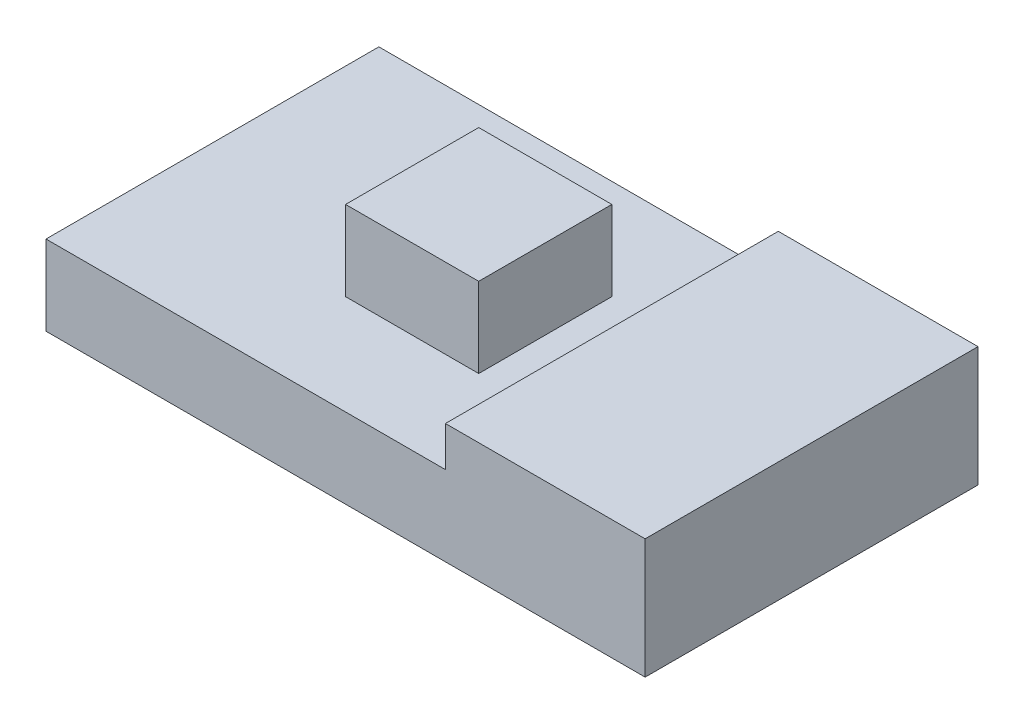
ISO-10303-21;
HEADER;
FILE_DESCRIPTION(('STEP AP214'),'2;1');
FILE_NAME('part.step','',(''),(''),'','','');
FILE_SCHEMA(('AUTOMOTIVE_DESIGN { 1 0 10303 214 1 1 1 1 }'));
ENDSEC;
DATA;
#1=APPLICATION_CONTEXT('core data for automotive mechanical design processes');
#2=APPLICATION_PROTOCOL_DEFINITION('international standard','automotive_design',2000,#1);
#3=PRODUCT_CONTEXT('',#1,'mechanical');
#4=PRODUCT('Part','Part','',(#3));
#5=PRODUCT_RELATED_PRODUCT_CATEGORY('part','',(#4));
#6=PRODUCT_DEFINITION_FORMATION('','',#4);
#7=PRODUCT_DEFINITION_CONTEXT('part definition',#1,'design');
#8=PRODUCT_DEFINITION('design','',#6,#7);
#9=PRODUCT_DEFINITION_SHAPE('','',#8);
#10=(LENGTH_UNIT() NAMED_UNIT(*) SI_UNIT(.MILLI.,.METRE.));
#11=(NAMED_UNIT(*) PLANE_ANGLE_UNIT() SI_UNIT($,.RADIAN.));
#12=(NAMED_UNIT(*) SI_UNIT($,.STERADIAN.) SOLID_ANGLE_UNIT());
#13=UNCERTAINTY_MEASURE_WITH_UNIT(LENGTH_MEASURE(1.E-05),#10,'distance_accuracy_value','');
#14=(GEOMETRIC_REPRESENTATION_CONTEXT(3) GLOBAL_UNCERTAINTY_ASSIGNED_CONTEXT((#13)) GLOBAL_UNIT_ASSIGNED_CONTEXT((#10,
#11,#12)) REPRESENTATION_CONTEXT('',''));
#15=CARTESIAN_POINT('',(0.,0.,0.));
#16=DIRECTION('',(0.,0.,1.));
#17=DIRECTION('',(1.,0.,0.));
#18=AXIS2_PLACEMENT_3D('',#15,#16,#17);
#19=CARTESIAN_POINT('',(-15.9090909090909,6.,-12.5));
#20=DIRECTION('',(1.,0.,0.));
#21=DIRECTION('',(0.,0.,-1.));
#22=AXIS2_PLACEMENT_3D('',#19,#20,#21);
#23=PLANE('',#22);
#24=DIRECTION('',(0.,0.,-1.));
#25=VECTOR('',#24,1.);
#26=CARTESIAN_POINT('',(-15.9090909090909,6.,12.5));
#27=LINE('',#26,#25);
#28=CARTESIAN_POINT('',(-15.9090909090909,6.,5.));
#29=VERTEX_POINT('',#28);
#30=CARTESIAN_POINT('',(-15.9090909090909,6.,-5.));
#31=VERTEX_POINT('',#30);
#32=EDGE_CURVE('E11',#29,#31,#27,.T.);
#33=ORIENTED_EDGE('',*,*,#32,.F.);
#34=DIRECTION('',(0.,-1.,0.));
#35=VECTOR('',#34,1.);
#36=CARTESIAN_POINT('',(-15.9090909090909,12.,5.));
#37=LINE('',#36,#35);
#38=CARTESIAN_POINT('',(-15.9090909090909,12.,5.));
#39=VERTEX_POINT('',#38);
#40=EDGE_CURVE('E186',#39,#29,#37,.T.);
#41=ORIENTED_EDGE('',*,*,#40,.F.);
#42=DIRECTION('',(0.,0.,1.));
#43=VECTOR('',#42,1.);
#44=CARTESIAN_POINT('',(-15.9090909090909,12.,-5.));
#45=LINE('',#44,#43);
#46=CARTESIAN_POINT('',(-15.9090909090909,12.,-5.));
#47=VERTEX_POINT('',#46);
#48=EDGE_CURVE('E155',#47,#39,#45,.T.);
#49=ORIENTED_EDGE('',*,*,#48,.F.);
#50=DIRECTION('',(0.,-1.,0.));
#51=VECTOR('',#50,1.);
#52=CARTESIAN_POINT('',(-15.9090909090909,12.,-5.));
#53=LINE('',#52,#51);
#54=EDGE_CURVE('E169',#47,#31,#53,.T.);
#55=ORIENTED_EDGE('',*,*,#54,.T.);
#56=EDGE_LOOP('',(#33,#41,#49,#55));
#57=FACE_BOUND('',#56,.T.);
#58=ADVANCED_FACE('F41',(#57),#23,.F.);
#59=CARTESIAN_POINT('',(0.,6.,0.));
#60=DIRECTION('',(0.,1.,0.));
#61=DIRECTION('',(0.,0.,1.));
#62=AXIS2_PLACEMENT_3D('',#59,#60,#61);
#63=PLANE('',#62);
#64=DIRECTION('',(0.,0.,-1.));
#65=VECTOR('',#64,1.);
#66=CARTESIAN_POINT('',(-30.9090909090909,6.,12.5));
#67=LINE('',#66,#65);
#68=CARTESIAN_POINT('',(-30.9090909090909,6.,12.5));
#69=VERTEX_POINT('',#68);
#70=CARTESIAN_POINT('',(-30.9090909090909,6.,-12.5));
#71=VERTEX_POINT('',#70);
#72=EDGE_CURVE('E123',#69,#71,#67,.T.);
#73=ORIENTED_EDGE('',*,*,#72,.F.);
#74=DIRECTION('',(1.,0.,0.));
#75=VECTOR('',#74,1.);
#76=CARTESIAN_POINT('',(-15.9090909090909,6.,12.5));
#77=LINE('',#76,#75);
#78=CARTESIAN_POINT('',(-0.909090909090918,6.,12.5));
#79=VERTEX_POINT('',#78);
#80=EDGE_CURVE('E129',#69,#79,#77,.T.);
#81=ORIENTED_EDGE('',*,*,#80,.T.);
#82=DIRECTION('',(0.,0.,1.));
#83=VECTOR('',#82,1.);
#84=CARTESIAN_POINT('',(-0.909090909090922,6.,-12.5));
#85=LINE('',#84,#83);
#86=CARTESIAN_POINT('',(-0.90909090909092,6.,-12.5));
#87=VERTEX_POINT('',#86);
#88=EDGE_CURVE('E65',#87,#79,#85,.T.);
#89=ORIENTED_EDGE('',*,*,#88,.F.);
#90=DIRECTION('',(-1.,0.,0.));
#91=VECTOR('',#90,1.);
#92=CARTESIAN_POINT('',(-15.9090909090909,6.,-12.5));
#93=LINE('',#92,#91);
#94=EDGE_CURVE('E118',#87,#71,#93,.T.);
#95=ORIENTED_EDGE('',*,*,#94,.T.);
#96=EDGE_LOOP('',(#73,#81,#89,#95));
#97=FACE_BOUND('',#96,.T.);
#98=DIRECTION('',(0.,0.,-1.));
#99=VECTOR('',#98,1.);
#100=CARTESIAN_POINT('',(-5.90909090909092,6.,-5.));
#101=LINE('',#100,#99);
#102=CARTESIAN_POINT('',(-5.90909090909092,6.,5.));
#103=VERTEX_POINT('',#102);
#104=CARTESIAN_POINT('',(-5.90909090909092,6.,-5.));
#105=VERTEX_POINT('',#104);
#106=EDGE_CURVE('E172',#103,#105,#101,.T.);
#107=ORIENTED_EDGE('',*,*,#106,.F.);
#108=DIRECTION('',(1.,0.,0.));
#109=VECTOR('',#108,1.);
#110=CARTESIAN_POINT('',(-15.9090909090909,6.,5.));
#111=LINE('',#110,#109);
#112=EDGE_CURVE('E153',#29,#103,#111,.T.);
#113=ORIENTED_EDGE('',*,*,#112,.F.);
#114=ORIENTED_EDGE('',*,*,#32,.T.);
#115=DIRECTION('',(-1.,0.,0.));
#116=VECTOR('',#115,1.);
#117=CARTESIAN_POINT('',(-15.9090909090909,6.,-5.));
#118=LINE('',#117,#116);
#119=EDGE_CURVE('E160',#105,#31,#118,.T.);
#120=ORIENTED_EDGE('',*,*,#119,.F.);
#121=EDGE_LOOP('',(#107,#113,#114,#120));
#122=FACE_BOUND('',#121,.T.);
#123=ADVANCED_FACE('F120',(#97,#122),#63,.T.);
#124=CARTESIAN_POINT('',(-15.9090909090909,6.,12.5));
#125=DIRECTION('',(0.,0.,-1.));
#126=DIRECTION('',(-1.,0.,0.));
#127=AXIS2_PLACEMENT_3D('',#124,#125,#126);
#128=PLANE('',#127);
#129=DIRECTION('',(1.,0.,0.));
#130=VECTOR('',#129,1.);
#131=CARTESIAN_POINT('',(-15.9090909090909,0.,12.5));
#132=LINE('',#131,#130);
#133=CARTESIAN_POINT('',(-30.9090909090909,0.,12.5));
#134=VERTEX_POINT('',#133);
#135=CARTESIAN_POINT('',(14.0909090909091,0.,12.5));
#136=VERTEX_POINT('',#135);
#137=EDGE_CURVE('E214',#134,#136,#132,.T.);
#138=ORIENTED_EDGE('',*,*,#137,.T.);
#139=DIRECTION('',(0.,-1.,0.));
#140=VECTOR('',#139,1.);
#141=CARTESIAN_POINT('',(14.0909090909091,6.,12.5));
#142=LINE('',#141,#140);
#143=CARTESIAN_POINT('',(14.0909090909091,9.,12.5));
#144=VERTEX_POINT('',#143);
#145=EDGE_CURVE('E44',#144,#136,#142,.T.);
#146=ORIENTED_EDGE('',*,*,#145,.F.);
#147=DIRECTION('',(1.,0.,0.));
#148=VECTOR('',#147,1.);
#149=CARTESIAN_POINT('',(-0.909090909090918,9.,12.5));
#150=LINE('',#149,#148);
#151=CARTESIAN_POINT('',(-0.909090909090918,9.,12.5));
#152=VERTEX_POINT('',#151);
#153=EDGE_CURVE('E197',#152,#144,#150,.T.);
#154=ORIENTED_EDGE('',*,*,#153,.F.);
#155=DIRECTION('',(0.,-1.,0.));
#156=VECTOR('',#155,1.);
#157=CARTESIAN_POINT('',(-0.909090909090918,9.,12.5));
#158=LINE('',#157,#156);
#159=EDGE_CURVE('E205',#152,#79,#158,.T.);
#160=ORIENTED_EDGE('',*,*,#159,.T.);
#161=ORIENTED_EDGE('',*,*,#80,.F.);
#162=DIRECTION('',(0.,1.,0.));
#163=VECTOR('',#162,1.);
#164=CARTESIAN_POINT('',(-30.9090909090909,0.,12.5));
#165=LINE('',#164,#163);
#166=EDGE_CURVE('E146',#134,#69,#165,.T.);
#167=ORIENTED_EDGE('',*,*,#166,.F.);
#168=EDGE_LOOP('',(#138,#146,#154,#160,#161,#167));
#169=FACE_BOUND('',#168,.T.);
#170=ADVANCED_FACE('F235',(#169),#128,.F.);
#171=CARTESIAN_POINT('',(14.0909090909091,6.,-12.5));
#172=DIRECTION('',(-1.,0.,0.));
#173=DIRECTION('',(0.,0.,1.));
#174=AXIS2_PLACEMENT_3D('',#171,#172,#173);
#175=PLANE('',#174);
#176=DIRECTION('',(0.,0.,-1.));
#177=VECTOR('',#176,1.);
#178=CARTESIAN_POINT('',(14.0909090909091,0.,-12.5));
#179=LINE('',#178,#177);
#180=CARTESIAN_POINT('',(14.0909090909091,0.,-12.5));
#181=VERTEX_POINT('',#180);
#182=EDGE_CURVE('E219',#136,#181,#179,.T.);
#183=ORIENTED_EDGE('',*,*,#182,.T.);
#184=DIRECTION('',(0.,-1.,0.));
#185=VECTOR('',#184,1.);
#186=CARTESIAN_POINT('',(14.0909090909091,6.,-12.5));
#187=LINE('',#186,#185);
#188=CARTESIAN_POINT('',(14.0909090909091,9.,-12.5));
#189=VERTEX_POINT('',#188);
#190=EDGE_CURVE('E128',#189,#181,#187,.T.);
#191=ORIENTED_EDGE('',*,*,#190,.F.);
#192=DIRECTION('',(0.,0.,-1.));
#193=VECTOR('',#192,1.);
#194=CARTESIAN_POINT('',(14.0909090909091,9.,12.5));
#195=LINE('',#194,#193);
#196=EDGE_CURVE('E201',#144,#189,#195,.T.);
#197=ORIENTED_EDGE('',*,*,#196,.F.);
#198=ORIENTED_EDGE('',*,*,#145,.T.);
#199=EDGE_LOOP('',(#183,#191,#197,#198));
#200=FACE_BOUND('',#199,.T.);
#201=ADVANCED_FACE('F230',(#200),#175,.F.);
#202=CARTESIAN_POINT('',(-15.9090909090909,6.,-12.5));
#203=DIRECTION('',(0.,0.,1.));
#204=DIRECTION('',(1.,0.,0.));
#205=AXIS2_PLACEMENT_3D('',#202,#203,#204);
#206=PLANE('',#205);
#207=DIRECTION('',(-1.,0.,0.));
#208=VECTOR('',#207,1.);
#209=CARTESIAN_POINT('',(-15.9090909090909,0.,-12.5));
#210=LINE('',#209,#208);
#211=CARTESIAN_POINT('',(-30.9090909090909,0.,-12.5));
#212=VERTEX_POINT('',#211);
#213=EDGE_CURVE('E136',#181,#212,#210,.T.);
#214=ORIENTED_EDGE('',*,*,#213,.T.);
#215=DIRECTION('',(0.,-1.,0.));
#216=VECTOR('',#215,1.);
#217=CARTESIAN_POINT('',(-30.9090909090909,6.,-12.5));
#218=LINE('',#217,#216);
#219=EDGE_CURVE('E132',#71,#212,#218,.T.);
#220=ORIENTED_EDGE('',*,*,#219,.F.);
#221=ORIENTED_EDGE('',*,*,#94,.F.);
#222=DIRECTION('',(0.,-1.,0.));
#223=VECTOR('',#222,1.);
#224=CARTESIAN_POINT('',(-0.909090909090922,9.,-12.5));
#225=LINE('',#224,#223);
#226=CARTESIAN_POINT('',(-0.909090909090922,9.,-12.5));
#227=VERTEX_POINT('',#226);
#228=EDGE_CURVE('E211',#227,#87,#225,.T.);
#229=ORIENTED_EDGE('',*,*,#228,.F.);
#230=DIRECTION('',(-1.,0.,0.));
#231=VECTOR('',#230,1.);
#232=CARTESIAN_POINT('',(14.0909090909091,9.,-12.5));
#233=LINE('',#232,#231);
#234=EDGE_CURVE('E190',#189,#227,#233,.T.);
#235=ORIENTED_EDGE('',*,*,#234,.F.);
#236=ORIENTED_EDGE('',*,*,#190,.T.);
#237=EDGE_LOOP('',(#214,#220,#221,#229,#235,#236));
#238=FACE_BOUND('',#237,.T.);
#239=ADVANCED_FACE('F133',(#238),#206,.F.);
#240=CARTESIAN_POINT('',(0.,0.,0.));
#241=DIRECTION('',(0.,1.,0.));
#242=DIRECTION('',(0.,0.,1.));
#243=AXIS2_PLACEMENT_3D('',#240,#241,#242);
#244=PLANE('',#243);
#245=ORIENTED_EDGE('',*,*,#137,.F.);
#246=DIRECTION('',(0.,0.,1.));
#247=VECTOR('',#246,1.);
#248=CARTESIAN_POINT('',(-30.9090909090909,0.,-12.5));
#249=LINE('',#248,#247);
#250=EDGE_CURVE('E141',#212,#134,#249,.T.);
#251=ORIENTED_EDGE('',*,*,#250,.F.);
#252=ORIENTED_EDGE('',*,*,#213,.F.);
#253=ORIENTED_EDGE('',*,*,#182,.F.);
#254=EDGE_LOOP('',(#245,#251,#252,#253));
#255=FACE_BOUND('',#254,.T.);
#256=ADVANCED_FACE('F234',(#255),#244,.F.);
#257=CARTESIAN_POINT('',(-0.909090909090922,9.,-12.5));
#258=DIRECTION('',(1.,0.,0.));
#259=DIRECTION('',(0.,0.,-1.));
#260=AXIS2_PLACEMENT_3D('',#257,#258,#259);
#261=PLANE('',#260);
#262=ORIENTED_EDGE('',*,*,#88,.T.);
#263=ORIENTED_EDGE('',*,*,#159,.F.);
#264=DIRECTION('',(0.,0.,1.));
#265=VECTOR('',#264,1.);
#266=CARTESIAN_POINT('',(-0.909090909090922,9.,-12.5));
#267=LINE('',#266,#265);
#268=EDGE_CURVE('E194',#227,#152,#267,.T.);
#269=ORIENTED_EDGE('',*,*,#268,.F.);
#270=ORIENTED_EDGE('',*,*,#228,.T.);
#271=EDGE_LOOP('',(#262,#263,#269,#270));
#272=FACE_BOUND('',#271,.T.);
#273=ADVANCED_FACE('F238',(#272),#261,.F.);
#274=CARTESIAN_POINT('',(0.,9.,0.));
#275=DIRECTION('',(0.,1.,0.));
#276=DIRECTION('',(0.,0.,1.));
#277=AXIS2_PLACEMENT_3D('',#274,#275,#276);
#278=PLANE('',#277);
#279=ORIENTED_EDGE('',*,*,#234,.T.);
#280=ORIENTED_EDGE('',*,*,#268,.T.);
#281=ORIENTED_EDGE('',*,*,#153,.T.);
#282=ORIENTED_EDGE('',*,*,#196,.T.);
#283=EDGE_LOOP('',(#279,#280,#281,#282));
#284=FACE_BOUND('',#283,.T.);
#285=ADVANCED_FACE('F240',(#284),#278,.T.);
#286=CARTESIAN_POINT('',(-15.9090909090909,12.,5.));
#287=DIRECTION('',(0.,0.,-1.));
#288=DIRECTION('',(-1.,0.,0.));
#289=AXIS2_PLACEMENT_3D('',#286,#287,#288);
#290=PLANE('',#289);
#291=ORIENTED_EDGE('',*,*,#112,.T.);
#292=DIRECTION('',(0.,-1.,0.));
#293=VECTOR('',#292,1.);
#294=CARTESIAN_POINT('',(-5.90909090909092,12.,5.));
#295=LINE('',#294,#293);
#296=CARTESIAN_POINT('',(-5.90909090909092,12.,5.));
#297=VERTEX_POINT('',#296);
#298=EDGE_CURVE('E182',#297,#103,#295,.T.);
#299=ORIENTED_EDGE('',*,*,#298,.F.);
#300=DIRECTION('',(1.,0.,0.));
#301=VECTOR('',#300,1.);
#302=CARTESIAN_POINT('',(-15.9090909090909,12.,5.));
#303=LINE('',#302,#301);
#304=EDGE_CURVE('E159',#39,#297,#303,.T.);
#305=ORIENTED_EDGE('',*,*,#304,.F.);
#306=ORIENTED_EDGE('',*,*,#40,.T.);
#307=EDGE_LOOP('',(#291,#299,#305,#306));
#308=FACE_BOUND('',#307,.T.);
#309=ADVANCED_FACE('F242',(#308),#290,.F.);
#310=CARTESIAN_POINT('',(-5.90909090909092,12.,-5.));
#311=DIRECTION('',(-1.,0.,0.));
#312=DIRECTION('',(0.,0.,1.));
#313=AXIS2_PLACEMENT_3D('',#310,#311,#312);
#314=PLANE('',#313);
#315=ORIENTED_EDGE('',*,*,#106,.T.);
#316=DIRECTION('',(0.,-1.,0.));
#317=VECTOR('',#316,1.);
#318=CARTESIAN_POINT('',(-5.90909090909092,12.,-5.));
#319=LINE('',#318,#317);
#320=CARTESIAN_POINT('',(-5.90909090909092,12.,-5.));
#321=VERTEX_POINT('',#320);
#322=EDGE_CURVE('E57',#321,#105,#319,.T.);
#323=ORIENTED_EDGE('',*,*,#322,.F.);
#324=DIRECTION('',(0.,0.,-1.));
#325=VECTOR('',#324,1.);
#326=CARTESIAN_POINT('',(-5.90909090909092,12.,-5.));
#327=LINE('',#326,#325);
#328=EDGE_CURVE('E163',#297,#321,#327,.T.);
#329=ORIENTED_EDGE('',*,*,#328,.F.);
#330=ORIENTED_EDGE('',*,*,#298,.T.);
#331=EDGE_LOOP('',(#315,#323,#329,#330));
#332=FACE_BOUND('',#331,.T.);
#333=ADVANCED_FACE('F249',(#332),#314,.F.);
#334=CARTESIAN_POINT('',(-15.9090909090909,12.,-5.));
#335=DIRECTION('',(0.,0.,1.));
#336=DIRECTION('',(1.,0.,0.));
#337=AXIS2_PLACEMENT_3D('',#334,#335,#336);
#338=PLANE('',#337);
#339=ORIENTED_EDGE('',*,*,#119,.T.);
#340=ORIENTED_EDGE('',*,*,#54,.F.);
#341=DIRECTION('',(-1.,0.,0.));
#342=VECTOR('',#341,1.);
#343=CARTESIAN_POINT('',(-15.9090909090909,12.,-5.));
#344=LINE('',#343,#342);
#345=EDGE_CURVE('E166',#321,#47,#344,.T.);
#346=ORIENTED_EDGE('',*,*,#345,.F.);
#347=ORIENTED_EDGE('',*,*,#322,.T.);
#348=EDGE_LOOP('',(#339,#340,#346,#347));
#349=FACE_BOUND('',#348,.T.);
#350=ADVANCED_FACE('F272',(#349),#338,.F.);
#351=CARTESIAN_POINT('',(0.,12.,0.));
#352=DIRECTION('',(0.,1.,0.));
#353=DIRECTION('',(0.,0.,1.));
#354=AXIS2_PLACEMENT_3D('',#351,#352,#353);
#355=PLANE('',#354);
#356=ORIENTED_EDGE('',*,*,#48,.T.);
#357=ORIENTED_EDGE('',*,*,#304,.T.);
#358=ORIENTED_EDGE('',*,*,#328,.T.);
#359=ORIENTED_EDGE('',*,*,#345,.T.);
#360=EDGE_LOOP('',(#356,#357,#358,#359));
#361=FACE_BOUND('',#360,.T.);
#362=ADVANCED_FACE('F271',(#361),#355,.T.);
#363=CARTESIAN_POINT('',(-30.9090909090909,0.,0.));
#364=DIRECTION('',(-1.,0.,0.));
#365=DIRECTION('',(0.,0.,1.));
#366=AXIS2_PLACEMENT_3D('',#363,#364,#365);
#367=PLANE('',#366);
#368=ORIENTED_EDGE('',*,*,#72,.T.);
#369=ORIENTED_EDGE('',*,*,#219,.T.);
#370=ORIENTED_EDGE('',*,*,#250,.T.);
#371=ORIENTED_EDGE('',*,*,#166,.T.);
#372=EDGE_LOOP('',(#368,#369,#370,#371));
#373=FACE_BOUND('',#372,.T.);
#374=ADVANCED_FACE('F144',(#373),#367,.T.);
#375=CLOSED_SHELL('',(#58,#123,#170,#201,#239,#256,#273,#285,#309,#333,#350,#362,#374));
#376=MANIFOLD_SOLID_BREP('B2',#375);
#377=ADVANCED_BREP_SHAPE_REPRESENTATION('',(#18,#376),#14);
#378=SHAPE_DEFINITION_REPRESENTATION(#9,#377);
ENDSEC;
END-ISO-10303-21;
